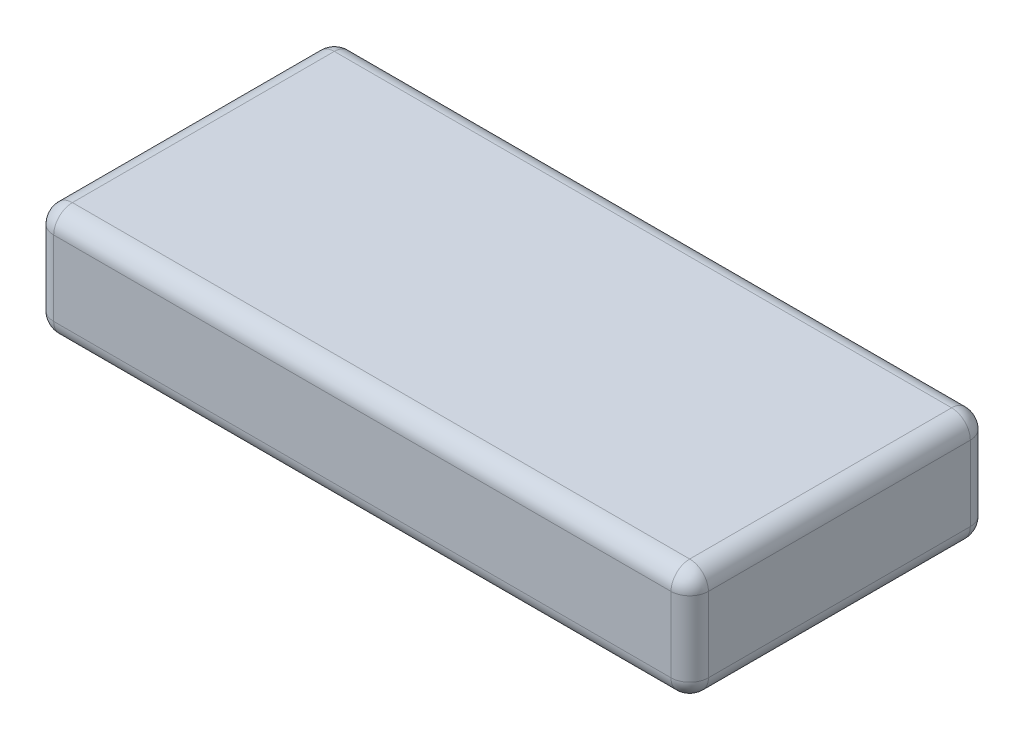
ISO-10303-21;
HEADER;
FILE_DESCRIPTION(('STEP AP214'),'2;1');
FILE_NAME('part.step','',(''),(''),'','','');
FILE_SCHEMA(('AUTOMOTIVE_DESIGN { 1 0 10303 214 1 1 1 1 }'));
ENDSEC;
DATA;
#1=APPLICATION_CONTEXT('core data for automotive mechanical design processes');
#2=APPLICATION_PROTOCOL_DEFINITION('international standard','automotive_design',2000,#1);
#3=PRODUCT_CONTEXT('',#1,'mechanical');
#4=PRODUCT('Part','Part','',(#3));
#5=PRODUCT_RELATED_PRODUCT_CATEGORY('part','',(#4));
#6=PRODUCT_DEFINITION_FORMATION('','',#4);
#7=PRODUCT_DEFINITION_CONTEXT('part definition',#1,'design');
#8=PRODUCT_DEFINITION('design','',#6,#7);
#9=PRODUCT_DEFINITION_SHAPE('','',#8);
#10=(LENGTH_UNIT() NAMED_UNIT(*) SI_UNIT(.MILLI.,.METRE.));
#11=(NAMED_UNIT(*) PLANE_ANGLE_UNIT() SI_UNIT($,.RADIAN.));
#12=(NAMED_UNIT(*) SI_UNIT($,.STERADIAN.) SOLID_ANGLE_UNIT());
#13=UNCERTAINTY_MEASURE_WITH_UNIT(LENGTH_MEASURE(1.E-05),#10,'distance_accuracy_value','');
#14=(GEOMETRIC_REPRESENTATION_CONTEXT(3) GLOBAL_UNCERTAINTY_ASSIGNED_CONTEXT((#13)) GLOBAL_UNIT_ASSIGNED_CONTEXT((#10,
#11,#12)) REPRESENTATION_CONTEXT('',''));
#15=CARTESIAN_POINT('',(0.,0.,0.));
#16=DIRECTION('',(0.,0.,1.));
#17=DIRECTION('',(1.,0.,0.));
#18=AXIS2_PLACEMENT_3D('',#15,#16,#17);
#19=CARTESIAN_POINT('',(33.,88.,-4.));
#20=DIRECTION('',(0.,-1.,0.));
#21=DIRECTION('',(1.,0.,0.));
#22=AXIS2_PLACEMENT_3D('',#19,#20,#21);
#23=SPHERICAL_SURFACE('',#22,2.);
#24=CARTESIAN_POINT('',(33.,88.,-4.));
#25=DIRECTION('',(0.,0.,-1.));
#26=DIRECTION('',(1.,0.,0.));
#27=AXIS2_PLACEMENT_3D('',#24,#25,#26);
#28=CIRCLE('',#27,2.);
#29=CARTESIAN_POINT('',(33.,90.,-4.));
#30=VERTEX_POINT('',#29);
#31=CARTESIAN_POINT('',(35.,88.,-4.));
#32=VERTEX_POINT('',#31);
#33=EDGE_CURVE('E10',#30,#32,#28,.T.);
#34=ORIENTED_EDGE('',*,*,#33,.F.);
#35=CARTESIAN_POINT('',(33.,88.,-4.));
#36=DIRECTION('',(1.,0.,0.));
#37=DIRECTION('',(0.,0.,1.));
#38=AXIS2_PLACEMENT_3D('',#35,#36,#37);
#39=CIRCLE('',#38,2.);
#40=CARTESIAN_POINT('',(33.,88.,-2.));
#41=VERTEX_POINT('',#40);
#42=EDGE_CURVE('E236',#30,#41,#39,.T.);
#43=ORIENTED_EDGE('',*,*,#42,.T.);
#44=CARTESIAN_POINT('',(33.,88.,-4.));
#45=DIRECTION('',(0.,-1.,0.));
#46=DIRECTION('',(1.,0.,0.));
#47=AXIS2_PLACEMENT_3D('',#44,#45,#46);
#48=CIRCLE('',#47,2.);
#49=EDGE_CURVE('E244',#32,#41,#48,.T.);
#50=ORIENTED_EDGE('',*,*,#49,.F.);
#51=EDGE_LOOP('',(#34,#43,#50));
#52=FACE_BOUND('',#51,.T.);
#53=ADVANCED_FACE('F16',(#52),#23,.T.);
#54=CARTESIAN_POINT('',(33.,88.,-32.));
#55=DIRECTION('',(0.,0.,1.));
#56=DIRECTION('',(1.,0.,0.));
#57=AXIS2_PLACEMENT_3D('',#54,#55,#56);
#58=SPHERICAL_SURFACE('',#57,2.);
#59=CARTESIAN_POINT('',(33.,88.,-32.));
#60=DIRECTION('',(0.,-1.,0.));
#61=DIRECTION('',(1.,0.,0.));
#62=AXIS2_PLACEMENT_3D('',#59,#60,#61);
#63=CIRCLE('',#62,2.);
#64=CARTESIAN_POINT('',(33.,88.,-34.));
#65=VERTEX_POINT('',#64);
#66=CARTESIAN_POINT('',(35.,88.,-32.));
#67=VERTEX_POINT('',#66);
#68=EDGE_CURVE('E228',#65,#67,#63,.T.);
#69=ORIENTED_EDGE('',*,*,#68,.F.);
#70=CARTESIAN_POINT('',(33.,88.,-32.));
#71=DIRECTION('',(1.,0.,0.));
#72=DIRECTION('',(0.,1.,0.));
#73=AXIS2_PLACEMENT_3D('',#70,#71,#72);
#74=CIRCLE('',#73,2.);
#75=CARTESIAN_POINT('',(33.,90.,-32.));
#76=VERTEX_POINT('',#75);
#77=EDGE_CURVE('E203',#65,#76,#74,.T.);
#78=ORIENTED_EDGE('',*,*,#77,.T.);
#79=CARTESIAN_POINT('',(33.,88.,-32.));
#80=DIRECTION('',(0.,0.,1.));
#81=DIRECTION('',(1.,0.,0.));
#82=AXIS2_PLACEMENT_3D('',#79,#80,#81);
#83=CIRCLE('',#82,2.);
#84=EDGE_CURVE('E24',#67,#76,#83,.T.);
#85=ORIENTED_EDGE('',*,*,#84,.F.);
#86=EDGE_LOOP('',(#69,#78,#85));
#87=FACE_BOUND('',#86,.T.);
#88=ADVANCED_FACE('F396',(#87),#58,.T.);
#89=CARTESIAN_POINT('',(35.,78.,-34.));
#90=DIRECTION('',(1.,0.,0.));
#91=DIRECTION('',(0.,1.,0.));
#92=AXIS2_PLACEMENT_3D('',#89,#90,#91);
#93=PLANE('',#92);
#94=DIRECTION('',(0.,0.,1.));
#95=VECTOR('',#94,1.);
#96=CARTESIAN_POINT('',(35.,80.,-34.));
#97=LINE('',#96,#95);
#98=CARTESIAN_POINT('',(35.,80.,-32.));
#99=VERTEX_POINT('',#98);
#100=CARTESIAN_POINT('',(35.,80.,-4.));
#101=VERTEX_POINT('',#100);
#102=EDGE_CURVE('E141',#99,#101,#97,.T.);
#103=ORIENTED_EDGE('',*,*,#102,.F.);
#104=DIRECTION('',(0.,1.,0.));
#105=VECTOR('',#104,1.);
#106=CARTESIAN_POINT('',(35.,78.,-32.));
#107=LINE('',#106,#105);
#108=EDGE_CURVE('E232',#99,#67,#107,.T.);
#109=ORIENTED_EDGE('',*,*,#108,.T.);
#110=DIRECTION('',(0.,0.,1.));
#111=VECTOR('',#110,1.);
#112=CARTESIAN_POINT('',(35.,88.,-34.));
#113=LINE('',#112,#111);
#114=EDGE_CURVE('E179',#67,#32,#113,.T.);
#115=ORIENTED_EDGE('',*,*,#114,.T.);
#116=DIRECTION('',(0.,1.,0.));
#117=VECTOR('',#116,1.);
#118=CARTESIAN_POINT('',(35.,78.,-4.));
#119=LINE('',#118,#117);
#120=EDGE_CURVE('E240',#101,#32,#119,.T.);
#121=ORIENTED_EDGE('',*,*,#120,.F.);
#122=EDGE_LOOP('',(#103,#109,#115,#121));
#123=FACE_BOUND('',#122,.T.);
#124=ADVANCED_FACE('F392',(#123),#93,.T.);
#125=CARTESIAN_POINT('',(33.,80.,-4.));
#126=DIRECTION('',(0.,0.,-1.));
#127=DIRECTION('',(1.,0.,0.));
#128=AXIS2_PLACEMENT_3D('',#125,#126,#127);
#129=SPHERICAL_SURFACE('',#128,2.);
#130=CARTESIAN_POINT('',(33.,80.,-4.));
#131=DIRECTION('',(0.,1.,0.));
#132=DIRECTION('',(1.,0.,0.));
#133=AXIS2_PLACEMENT_3D('',#130,#131,#132);
#134=CIRCLE('',#133,2.);
#135=CARTESIAN_POINT('',(33.,80.,-2.));
#136=VERTEX_POINT('',#135);
#137=EDGE_CURVE('E150',#136,#101,#134,.T.);
#138=ORIENTED_EDGE('',*,*,#137,.F.);
#139=CARTESIAN_POINT('',(33.,80.,-4.));
#140=DIRECTION('',(1.,0.,0.));
#141=DIRECTION('',(0.,-1.,0.));
#142=AXIS2_PLACEMENT_3D('',#139,#140,#141);
#143=CIRCLE('',#142,2.);
#144=CARTESIAN_POINT('',(33.,78.,-4.));
#145=VERTEX_POINT('',#144);
#146=EDGE_CURVE('E145',#136,#145,#143,.T.);
#147=ORIENTED_EDGE('',*,*,#146,.T.);
#148=CARTESIAN_POINT('',(33.,80.,-4.));
#149=DIRECTION('',(0.,0.,-1.));
#150=DIRECTION('',(1.,0.,0.));
#151=AXIS2_PLACEMENT_3D('',#148,#149,#150);
#152=CIRCLE('',#151,2.);
#153=EDGE_CURVE('E133',#101,#145,#152,.T.);
#154=ORIENTED_EDGE('',*,*,#153,.F.);
#155=EDGE_LOOP('',(#138,#147,#154));
#156=FACE_BOUND('',#155,.T.);
#157=ADVANCED_FACE('F149',(#156),#129,.T.);
#158=CARTESIAN_POINT('',(33.,80.,-32.));
#159=DIRECTION('',(0.,0.,1.));
#160=DIRECTION('',(1.,0.,0.));
#161=AXIS2_PLACEMENT_3D('',#158,#159,#160);
#162=SPHERICAL_SURFACE('',#161,2.);
#163=CARTESIAN_POINT('',(33.,80.,-32.));
#164=DIRECTION('',(0.,0.,-1.));
#165=DIRECTION('',(1.,0.,0.));
#166=AXIS2_PLACEMENT_3D('',#163,#164,#165);
#167=CIRCLE('',#166,2.);
#168=CARTESIAN_POINT('',(33.,78.,-32.));
#169=VERTEX_POINT('',#168);
#170=EDGE_CURVE('E144',#99,#169,#167,.T.);
#171=ORIENTED_EDGE('',*,*,#170,.T.);
#172=CARTESIAN_POINT('',(33.,80.,-32.));
#173=DIRECTION('',(-1.,0.,0.));
#174=DIRECTION('',(0.,-1.,0.));
#175=AXIS2_PLACEMENT_3D('',#172,#173,#174);
#176=CIRCLE('',#175,2.);
#177=CARTESIAN_POINT('',(33.,80.,-34.));
#178=VERTEX_POINT('',#177);
#179=EDGE_CURVE('E154',#178,#169,#176,.T.);
#180=ORIENTED_EDGE('',*,*,#179,.F.);
#181=CARTESIAN_POINT('',(33.,80.,-32.));
#182=DIRECTION('',(0.,-1.,0.));
#183=DIRECTION('',(1.,0.,0.));
#184=AXIS2_PLACEMENT_3D('',#181,#182,#183);
#185=CIRCLE('',#184,2.);
#186=EDGE_CURVE('E224',#178,#99,#185,.T.);
#187=ORIENTED_EDGE('',*,*,#186,.T.);
#188=EDGE_LOOP('',(#171,#180,#187));
#189=FACE_BOUND('',#188,.T.);
#190=ADVANCED_FACE('F390',(#189),#162,.T.);
#191=CARTESIAN_POINT('',(33.,88.,-34.));
#192=DIRECTION('',(0.,0.,1.));
#193=DIRECTION('',(1.,0.,0.));
#194=AXIS2_PLACEMENT_3D('',#191,#192,#193);
#195=CYLINDRICAL_SURFACE('',#194,2.);
#196=ORIENTED_EDGE('',*,*,#114,.F.);
#197=ORIENTED_EDGE('',*,*,#84,.T.);
#198=DIRECTION('',(0.,0.,1.));
#199=VECTOR('',#198,1.);
#200=CARTESIAN_POINT('',(33.,90.,-34.));
#201=LINE('',#200,#199);
#202=EDGE_CURVE('E217',#76,#30,#201,.T.);
#203=ORIENTED_EDGE('',*,*,#202,.T.);
#204=ORIENTED_EDGE('',*,*,#33,.T.);
#205=EDGE_LOOP('',(#196,#197,#203,#204));
#206=FACE_BOUND('',#205,.T.);
#207=ADVANCED_FACE('F410',(#206),#195,.T.);
#208=CARTESIAN_POINT('',(33.,78.,-4.));
#209=DIRECTION('',(0.,1.,0.));
#210=DIRECTION('',(1.,0.,0.));
#211=AXIS2_PLACEMENT_3D('',#208,#209,#210);
#212=CYLINDRICAL_SURFACE('',#211,2.);
#213=ORIENTED_EDGE('',*,*,#120,.T.);
#214=ORIENTED_EDGE('',*,*,#49,.T.);
#215=DIRECTION('',(0.,1.,0.));
#216=VECTOR('',#215,1.);
#217=CARTESIAN_POINT('',(33.,78.,-2.));
#218=LINE('',#217,#216);
#219=EDGE_CURVE('E200',#136,#41,#218,.T.);
#220=ORIENTED_EDGE('',*,*,#219,.F.);
#221=ORIENTED_EDGE('',*,*,#137,.T.);
#222=EDGE_LOOP('',(#213,#214,#220,#221));
#223=FACE_BOUND('',#222,.T.);
#224=ADVANCED_FACE('F393',(#223),#212,.T.);
#225=CARTESIAN_POINT('',(-35.,88.,-4.));
#226=DIRECTION('',(1.,0.,0.));
#227=DIRECTION('',(0.,1.,0.));
#228=AXIS2_PLACEMENT_3D('',#225,#226,#227);
#229=CYLINDRICAL_SURFACE('',#228,2.);
#230=CARTESIAN_POINT('',(-33.,88.,-4.));
#231=DIRECTION('',(1.,0.,0.));
#232=DIRECTION('',(0.,0.,1.));
#233=AXIS2_PLACEMENT_3D('',#230,#231,#232);
#234=CIRCLE('',#233,2.);
#235=CARTESIAN_POINT('',(-33.,90.,-4.));
#236=VERTEX_POINT('',#235);
#237=CARTESIAN_POINT('',(-33.,88.,-2.));
#238=VERTEX_POINT('',#237);
#239=EDGE_CURVE('E178',#236,#238,#234,.T.);
#240=ORIENTED_EDGE('',*,*,#239,.T.);
#241=DIRECTION('',(1.,0.,0.));
#242=VECTOR('',#241,1.);
#243=CARTESIAN_POINT('',(-35.,88.,-2.));
#244=LINE('',#243,#242);
#245=EDGE_CURVE('E207',#238,#41,#244,.T.);
#246=ORIENTED_EDGE('',*,*,#245,.T.);
#247=ORIENTED_EDGE('',*,*,#42,.F.);
#248=DIRECTION('',(1.,0.,0.));
#249=VECTOR('',#248,1.);
#250=CARTESIAN_POINT('',(-35.,90.,-4.));
#251=LINE('',#250,#249);
#252=EDGE_CURVE('E213',#236,#30,#251,.T.);
#253=ORIENTED_EDGE('',*,*,#252,.F.);
#254=EDGE_LOOP('',(#240,#246,#247,#253));
#255=FACE_BOUND('',#254,.T.);
#256=ADVANCED_FACE('F372',(#255),#229,.T.);
#257=CARTESIAN_POINT('',(33.,78.,-32.));
#258=DIRECTION('',(0.,1.,0.));
#259=DIRECTION('',(1.,0.,0.));
#260=AXIS2_PLACEMENT_3D('',#257,#258,#259);
#261=CYLINDRICAL_SURFACE('',#260,2.);
#262=ORIENTED_EDGE('',*,*,#186,.F.);
#263=DIRECTION('',(0.,1.,0.));
#264=VECTOR('',#263,1.);
#265=CARTESIAN_POINT('',(33.,78.,-34.));
#266=LINE('',#265,#264);
#267=EDGE_CURVE('E184',#178,#65,#266,.T.);
#268=ORIENTED_EDGE('',*,*,#267,.T.);
#269=ORIENTED_EDGE('',*,*,#68,.T.);
#270=ORIENTED_EDGE('',*,*,#108,.F.);
#271=EDGE_LOOP('',(#262,#268,#269,#270));
#272=FACE_BOUND('',#271,.T.);
#273=ADVANCED_FACE('F415',(#272),#261,.T.);
#274=CARTESIAN_POINT('',(-35.,88.,-32.));
#275=DIRECTION('',(1.,0.,0.));
#276=DIRECTION('',(0.,1.,0.));
#277=AXIS2_PLACEMENT_3D('',#274,#275,#276);
#278=CYLINDRICAL_SURFACE('',#277,2.);
#279=DIRECTION('',(1.,0.,0.));
#280=VECTOR('',#279,1.);
#281=CARTESIAN_POINT('',(-35.,90.,-32.));
#282=LINE('',#281,#280);
#283=CARTESIAN_POINT('',(-33.,90.,-32.));
#284=VERTEX_POINT('',#283);
#285=EDGE_CURVE('E220',#284,#76,#282,.T.);
#286=ORIENTED_EDGE('',*,*,#285,.T.);
#287=ORIENTED_EDGE('',*,*,#77,.F.);
#288=DIRECTION('',(1.,0.,0.));
#289=VECTOR('',#288,1.);
#290=CARTESIAN_POINT('',(-35.,88.,-34.));
#291=LINE('',#290,#289);
#292=CARTESIAN_POINT('',(-33.,88.,-34.));
#293=VERTEX_POINT('',#292);
#294=EDGE_CURVE('E165',#293,#65,#291,.T.);
#295=ORIENTED_EDGE('',*,*,#294,.F.);
#296=CARTESIAN_POINT('',(-33.,88.,-32.));
#297=DIRECTION('',(1.,0.,0.));
#298=DIRECTION('',(0.,1.,0.));
#299=AXIS2_PLACEMENT_3D('',#296,#297,#298);
#300=CIRCLE('',#299,2.);
#301=EDGE_CURVE('E192',#293,#284,#300,.T.);
#302=ORIENTED_EDGE('',*,*,#301,.T.);
#303=EDGE_LOOP('',(#286,#287,#295,#302));
#304=FACE_BOUND('',#303,.T.);
#305=ADVANCED_FACE('F382',(#304),#278,.T.);
#306=CARTESIAN_POINT('',(33.,80.,-34.));
#307=DIRECTION('',(0.,0.,1.));
#308=DIRECTION('',(1.,0.,0.));
#309=AXIS2_PLACEMENT_3D('',#306,#307,#308);
#310=CYLINDRICAL_SURFACE('',#309,2.);
#311=ORIENTED_EDGE('',*,*,#153,.T.);
#312=DIRECTION('',(0.,0.,1.));
#313=VECTOR('',#312,1.);
#314=CARTESIAN_POINT('',(33.,78.,-34.));
#315=LINE('',#314,#313);
#316=EDGE_CURVE('E138',#169,#145,#315,.T.);
#317=ORIENTED_EDGE('',*,*,#316,.F.);
#318=ORIENTED_EDGE('',*,*,#170,.F.);
#319=ORIENTED_EDGE('',*,*,#102,.T.);
#320=EDGE_LOOP('',(#311,#317,#318,#319));
#321=FACE_BOUND('',#320,.T.);
#322=ADVANCED_FACE('F135',(#321),#310,.T.);
#323=CARTESIAN_POINT('',(-35.,80.,-4.));
#324=DIRECTION('',(1.,0.,0.));
#325=DIRECTION('',(0.,-1.,0.));
#326=AXIS2_PLACEMENT_3D('',#323,#324,#325);
#327=CYLINDRICAL_SURFACE('',#326,2.);
#328=DIRECTION('',(1.,0.,0.));
#329=VECTOR('',#328,1.);
#330=CARTESIAN_POINT('',(-35.,78.,-4.));
#331=LINE('',#330,#329);
#332=CARTESIAN_POINT('',(-33.,78.,-4.));
#333=VERTEX_POINT('',#332);
#334=EDGE_CURVE('E157',#333,#145,#331,.T.);
#335=ORIENTED_EDGE('',*,*,#334,.T.);
#336=ORIENTED_EDGE('',*,*,#146,.F.);
#337=DIRECTION('',(1.,0.,0.));
#338=VECTOR('',#337,1.);
#339=CARTESIAN_POINT('',(-35.,80.,-2.));
#340=LINE('',#339,#338);
#341=CARTESIAN_POINT('',(-33.,80.,-2.));
#342=VERTEX_POINT('',#341);
#343=EDGE_CURVE('E196',#342,#136,#340,.T.);
#344=ORIENTED_EDGE('',*,*,#343,.F.);
#345=CARTESIAN_POINT('',(-33.,80.,-4.));
#346=DIRECTION('',(1.,0.,0.));
#347=DIRECTION('',(0.,-1.,0.));
#348=AXIS2_PLACEMENT_3D('',#345,#346,#347);
#349=CIRCLE('',#348,2.);
#350=EDGE_CURVE('E160',#342,#333,#349,.T.);
#351=ORIENTED_EDGE('',*,*,#350,.T.);
#352=EDGE_LOOP('',(#335,#336,#344,#351));
#353=FACE_BOUND('',#352,.T.);
#354=ADVANCED_FACE('F158',(#353),#327,.T.);
#355=CARTESIAN_POINT('',(-35.,80.,-32.));
#356=DIRECTION('',(1.,0.,0.));
#357=DIRECTION('',(0.,-1.,0.));
#358=AXIS2_PLACEMENT_3D('',#355,#356,#357);
#359=CYLINDRICAL_SURFACE('',#358,2.);
#360=CARTESIAN_POINT('',(-33.,80.,-32.));
#361=DIRECTION('',(-1.,0.,0.));
#362=DIRECTION('',(0.,-1.,0.));
#363=AXIS2_PLACEMENT_3D('',#360,#361,#362);
#364=CIRCLE('',#363,2.);
#365=CARTESIAN_POINT('',(-33.,80.,-34.));
#366=VERTEX_POINT('',#365);
#367=CARTESIAN_POINT('',(-33.,78.,-32.));
#368=VERTEX_POINT('',#367);
#369=EDGE_CURVE('E259',#366,#368,#364,.T.);
#370=ORIENTED_EDGE('',*,*,#369,.F.);
#371=DIRECTION('',(1.,0.,0.));
#372=VECTOR('',#371,1.);
#373=CARTESIAN_POINT('',(-35.,80.,-34.));
#374=LINE('',#373,#372);
#375=EDGE_CURVE('E188',#366,#178,#374,.T.);
#376=ORIENTED_EDGE('',*,*,#375,.T.);
#377=ORIENTED_EDGE('',*,*,#179,.T.);
#378=DIRECTION('',(1.,0.,0.));
#379=VECTOR('',#378,1.);
#380=CARTESIAN_POINT('',(-35.,78.,-32.));
#381=LINE('',#380,#379);
#382=EDGE_CURVE('E168',#368,#169,#381,.T.);
#383=ORIENTED_EDGE('',*,*,#382,.F.);
#384=EDGE_LOOP('',(#370,#376,#377,#383));
#385=FACE_BOUND('',#384,.T.);
#386=ADVANCED_FACE('F387',(#385),#359,.T.);
#387=CARTESIAN_POINT('',(-35.,90.,-34.));
#388=DIRECTION('',(0.,1.,0.));
#389=DIRECTION('',(1.,0.,0.));
#390=AXIS2_PLACEMENT_3D('',#387,#388,#389);
#391=PLANE('',#390);
#392=DIRECTION('',(0.,0.,1.));
#393=VECTOR('',#392,1.);
#394=CARTESIAN_POINT('',(-33.,90.,-34.));
#395=LINE('',#394,#393);
#396=EDGE_CURVE('E272',#284,#236,#395,.T.);
#397=ORIENTED_EDGE('',*,*,#396,.T.);
#398=ORIENTED_EDGE('',*,*,#252,.T.);
#399=ORIENTED_EDGE('',*,*,#202,.F.);
#400=ORIENTED_EDGE('',*,*,#285,.F.);
#401=EDGE_LOOP('',(#397,#398,#399,#400));
#402=FACE_BOUND('',#401,.T.);
#403=ADVANCED_FACE('F379',(#402),#391,.T.);
#404=CARTESIAN_POINT('',(-33.,88.,-4.));
#405=DIRECTION('',(0.,-1.,0.));
#406=DIRECTION('',(-1.,0.,0.));
#407=AXIS2_PLACEMENT_3D('',#404,#405,#406);
#408=SPHERICAL_SURFACE('',#407,2.);
#409=CARTESIAN_POINT('',(-33.,88.,-4.));
#410=DIRECTION('',(0.,1.,0.));
#411=DIRECTION('',(-1.,0.,0.));
#412=AXIS2_PLACEMENT_3D('',#409,#410,#411);
#413=CIRCLE('',#412,2.);
#414=CARTESIAN_POINT('',(-35.,88.,-4.));
#415=VERTEX_POINT('',#414);
#416=EDGE_CURVE('E323',#415,#238,#413,.T.);
#417=ORIENTED_EDGE('',*,*,#416,.T.);
#418=ORIENTED_EDGE('',*,*,#239,.F.);
#419=CARTESIAN_POINT('',(-33.,88.,-4.));
#420=DIRECTION('',(0.,0.,1.));
#421=DIRECTION('',(-1.,0.,0.));
#422=AXIS2_PLACEMENT_3D('',#419,#420,#421);
#423=CIRCLE('',#422,2.);
#424=EDGE_CURVE('E282',#236,#415,#423,.T.);
#425=ORIENTED_EDGE('',*,*,#424,.T.);
#426=EDGE_LOOP('',(#417,#418,#425));
#427=FACE_BOUND('',#426,.T.);
#428=ADVANCED_FACE('F334',(#427),#408,.T.);
#429=CARTESIAN_POINT('',(-35.,78.,-2.));
#430=DIRECTION('',(0.,0.,1.));
#431=DIRECTION('',(1.,0.,0.));
#432=AXIS2_PLACEMENT_3D('',#429,#430,#431);
#433=PLANE('',#432);
#434=DIRECTION('',(0.,1.,0.));
#435=VECTOR('',#434,1.);
#436=CARTESIAN_POINT('',(-33.,78.,-2.));
#437=LINE('',#436,#435);
#438=EDGE_CURVE('E322',#342,#238,#437,.T.);
#439=ORIENTED_EDGE('',*,*,#438,.F.);
#440=ORIENTED_EDGE('',*,*,#343,.T.);
#441=ORIENTED_EDGE('',*,*,#219,.T.);
#442=ORIENTED_EDGE('',*,*,#245,.F.);
#443=EDGE_LOOP('',(#439,#440,#441,#442));
#444=FACE_BOUND('',#443,.T.);
#445=ADVANCED_FACE('F369',(#444),#433,.T.);
#446=CARTESIAN_POINT('',(-33.,88.,-32.));
#447=DIRECTION('',(0.,0.,1.));
#448=DIRECTION('',(-1.,0.,0.));
#449=AXIS2_PLACEMENT_3D('',#446,#447,#448);
#450=SPHERICAL_SURFACE('',#449,2.);
#451=CARTESIAN_POINT('',(-33.,88.,-32.));
#452=DIRECTION('',(0.,0.,-1.));
#453=DIRECTION('',(-1.,0.,0.));
#454=AXIS2_PLACEMENT_3D('',#451,#452,#453);
#455=CIRCLE('',#454,2.);
#456=CARTESIAN_POINT('',(-35.,88.,-32.));
#457=VERTEX_POINT('',#456);
#458=EDGE_CURVE('E263',#457,#284,#455,.T.);
#459=ORIENTED_EDGE('',*,*,#458,.T.);
#460=ORIENTED_EDGE('',*,*,#301,.F.);
#461=CARTESIAN_POINT('',(-33.,88.,-32.));
#462=DIRECTION('',(0.,1.,0.));
#463=DIRECTION('',(-1.,0.,0.));
#464=AXIS2_PLACEMENT_3D('',#461,#462,#463);
#465=CIRCLE('',#464,2.);
#466=EDGE_CURVE('E313',#293,#457,#465,.T.);
#467=ORIENTED_EDGE('',*,*,#466,.T.);
#468=EDGE_LOOP('',(#459,#460,#467));
#469=FACE_BOUND('',#468,.T.);
#470=ADVANCED_FACE('F356',(#469),#450,.T.);
#471=CARTESIAN_POINT('',(-35.,78.,-34.));
#472=DIRECTION('',(0.,0.,1.));
#473=DIRECTION('',(1.,0.,0.));
#474=AXIS2_PLACEMENT_3D('',#471,#472,#473);
#475=PLANE('',#474);
#476=ORIENTED_EDGE('',*,*,#294,.T.);
#477=ORIENTED_EDGE('',*,*,#267,.F.);
#478=ORIENTED_EDGE('',*,*,#375,.F.);
#479=DIRECTION('',(0.,1.,0.));
#480=VECTOR('',#479,1.);
#481=CARTESIAN_POINT('',(-33.,78.,-34.));
#482=LINE('',#481,#480);
#483=EDGE_CURVE('E311',#366,#293,#482,.T.);
#484=ORIENTED_EDGE('',*,*,#483,.T.);
#485=EDGE_LOOP('',(#476,#477,#478,#484));
#486=FACE_BOUND('',#485,.T.);
#487=ADVANCED_FACE('F385',(#486),#475,.F.);
#488=CARTESIAN_POINT('',(-35.,78.,-34.));
#489=DIRECTION('',(0.,1.,0.));
#490=DIRECTION('',(1.,0.,0.));
#491=AXIS2_PLACEMENT_3D('',#488,#489,#490);
#492=PLANE('',#491);
#493=ORIENTED_EDGE('',*,*,#382,.T.);
#494=ORIENTED_EDGE('',*,*,#316,.T.);
#495=ORIENTED_EDGE('',*,*,#334,.F.);
#496=DIRECTION('',(0.,0.,1.));
#497=VECTOR('',#496,1.);
#498=CARTESIAN_POINT('',(-33.,78.,-34.));
#499=LINE('',#498,#497);
#500=EDGE_CURVE('E302',#368,#333,#499,.T.);
#501=ORIENTED_EDGE('',*,*,#500,.F.);
#502=EDGE_LOOP('',(#493,#494,#495,#501));
#503=FACE_BOUND('',#502,.T.);
#504=ADVANCED_FACE('F167',(#503),#492,.F.);
#505=CARTESIAN_POINT('',(-33.,80.,-4.));
#506=DIRECTION('',(0.,0.,-1.));
#507=DIRECTION('',(-1.,0.,0.));
#508=AXIS2_PLACEMENT_3D('',#505,#506,#507);
#509=SPHERICAL_SURFACE('',#508,2.);
#510=CARTESIAN_POINT('',(-33.,80.,-4.));
#511=DIRECTION('',(0.,0.,1.));
#512=DIRECTION('',(-1.,0.,0.));
#513=AXIS2_PLACEMENT_3D('',#510,#511,#512);
#514=CIRCLE('',#513,2.);
#515=CARTESIAN_POINT('',(-35.,80.,-4.));
#516=VERTEX_POINT('',#515);
#517=EDGE_CURVE('E306',#516,#333,#514,.T.);
#518=ORIENTED_EDGE('',*,*,#517,.T.);
#519=ORIENTED_EDGE('',*,*,#350,.F.);
#520=CARTESIAN_POINT('',(-33.,80.,-4.));
#521=DIRECTION('',(0.,-1.,0.));
#522=DIRECTION('',(-1.,0.,0.));
#523=AXIS2_PLACEMENT_3D('',#520,#521,#522);
#524=CIRCLE('',#523,2.);
#525=EDGE_CURVE('E310',#342,#516,#524,.T.);
#526=ORIENTED_EDGE('',*,*,#525,.T.);
#527=EDGE_LOOP('',(#518,#519,#526));
#528=FACE_BOUND('',#527,.T.);
#529=ADVANCED_FACE('F366',(#528),#509,.T.);
#530=CARTESIAN_POINT('',(-33.,80.,-32.));
#531=DIRECTION('',(0.,0.,1.));
#532=DIRECTION('',(-1.,0.,0.));
#533=AXIS2_PLACEMENT_3D('',#530,#531,#532);
#534=SPHERICAL_SURFACE('',#533,2.);
#535=CARTESIAN_POINT('',(-33.,80.,-32.));
#536=DIRECTION('',(0.,1.,0.));
#537=DIRECTION('',(-1.,0.,0.));
#538=AXIS2_PLACEMENT_3D('',#535,#536,#537);
#539=CIRCLE('',#538,2.);
#540=CARTESIAN_POINT('',(-35.,80.,-32.));
#541=VERTEX_POINT('',#540);
#542=EDGE_CURVE('E307',#366,#541,#539,.T.);
#543=ORIENTED_EDGE('',*,*,#542,.F.);
#544=ORIENTED_EDGE('',*,*,#369,.T.);
#545=CARTESIAN_POINT('',(-33.,80.,-32.));
#546=DIRECTION('',(0.,0.,1.));
#547=DIRECTION('',(-1.,0.,0.));
#548=AXIS2_PLACEMENT_3D('',#545,#546,#547);
#549=CIRCLE('',#548,2.);
#550=EDGE_CURVE('E295',#541,#368,#549,.T.);
#551=ORIENTED_EDGE('',*,*,#550,.F.);
#552=EDGE_LOOP('',(#543,#544,#551));
#553=FACE_BOUND('',#552,.T.);
#554=ADVANCED_FACE('F361',(#553),#534,.T.);
#555=CARTESIAN_POINT('',(-33.,88.,-34.));
#556=DIRECTION('',(0.,0.,1.));
#557=DIRECTION('',(-1.,0.,0.));
#558=AXIS2_PLACEMENT_3D('',#555,#556,#557);
#559=CYLINDRICAL_SURFACE('',#558,2.);
#560=ORIENTED_EDGE('',*,*,#424,.F.);
#561=ORIENTED_EDGE('',*,*,#396,.F.);
#562=ORIENTED_EDGE('',*,*,#458,.F.);
#563=DIRECTION('',(0.,0.,1.));
#564=VECTOR('',#563,1.);
#565=CARTESIAN_POINT('',(-35.,88.,-34.));
#566=LINE('',#565,#564);
#567=EDGE_CURVE('E286',#457,#415,#566,.T.);
#568=ORIENTED_EDGE('',*,*,#567,.T.);
#569=EDGE_LOOP('',(#560,#561,#562,#568));
#570=FACE_BOUND('',#569,.T.);
#571=ADVANCED_FACE('F345',(#570),#559,.T.);
#572=CARTESIAN_POINT('',(-33.,78.,-4.));
#573=DIRECTION('',(0.,1.,0.));
#574=DIRECTION('',(-1.,0.,0.));
#575=AXIS2_PLACEMENT_3D('',#572,#573,#574);
#576=CYLINDRICAL_SURFACE('',#575,2.);
#577=ORIENTED_EDGE('',*,*,#525,.F.);
#578=ORIENTED_EDGE('',*,*,#438,.T.);
#579=ORIENTED_EDGE('',*,*,#416,.F.);
#580=DIRECTION('',(0.,1.,0.));
#581=VECTOR('',#580,1.);
#582=CARTESIAN_POINT('',(-35.,78.,-4.));
#583=LINE('',#582,#581);
#584=EDGE_CURVE('E342',#516,#415,#583,.T.);
#585=ORIENTED_EDGE('',*,*,#584,.F.);
#586=EDGE_LOOP('',(#577,#578,#579,#585));
#587=FACE_BOUND('',#586,.T.);
#588=ADVANCED_FACE('F340',(#587),#576,.T.);
#589=CARTESIAN_POINT('',(-33.,78.,-32.));
#590=DIRECTION('',(0.,1.,0.));
#591=DIRECTION('',(-1.,0.,0.));
#592=AXIS2_PLACEMENT_3D('',#589,#590,#591);
#593=CYLINDRICAL_SURFACE('',#592,2.);
#594=DIRECTION('',(0.,1.,0.));
#595=VECTOR('',#594,1.);
#596=CARTESIAN_POINT('',(-35.,78.,-32.));
#597=LINE('',#596,#595);
#598=EDGE_CURVE('E288',#541,#457,#597,.T.);
#599=ORIENTED_EDGE('',*,*,#598,.T.);
#600=ORIENTED_EDGE('',*,*,#466,.F.);
#601=ORIENTED_EDGE('',*,*,#483,.F.);
#602=ORIENTED_EDGE('',*,*,#542,.T.);
#603=EDGE_LOOP('',(#599,#600,#601,#602));
#604=FACE_BOUND('',#603,.T.);
#605=ADVANCED_FACE('F360',(#604),#593,.T.);
#606=CARTESIAN_POINT('',(-33.,80.,-34.));
#607=DIRECTION('',(0.,0.,1.));
#608=DIRECTION('',(-1.,0.,0.));
#609=AXIS2_PLACEMENT_3D('',#606,#607,#608);
#610=CYLINDRICAL_SURFACE('',#609,2.);
#611=DIRECTION('',(0.,0.,1.));
#612=VECTOR('',#611,1.);
#613=CARTESIAN_POINT('',(-35.,80.,-34.));
#614=LINE('',#613,#612);
#615=EDGE_CURVE('E291',#541,#516,#614,.T.);
#616=ORIENTED_EDGE('',*,*,#615,.F.);
#617=ORIENTED_EDGE('',*,*,#550,.T.);
#618=ORIENTED_EDGE('',*,*,#500,.T.);
#619=ORIENTED_EDGE('',*,*,#517,.F.);
#620=EDGE_LOOP('',(#616,#617,#618,#619));
#621=FACE_BOUND('',#620,.T.);
#622=ADVANCED_FACE('F364',(#621),#610,.T.);
#623=CARTESIAN_POINT('',(-35.,78.,-34.));
#624=DIRECTION('',(1.,0.,0.));
#625=DIRECTION('',(0.,1.,0.));
#626=AXIS2_PLACEMENT_3D('',#623,#624,#625);
#627=PLANE('',#626);
#628=ORIENTED_EDGE('',*,*,#584,.T.);
#629=ORIENTED_EDGE('',*,*,#567,.F.);
#630=ORIENTED_EDGE('',*,*,#598,.F.);
#631=ORIENTED_EDGE('',*,*,#615,.T.);
#632=EDGE_LOOP('',(#628,#629,#630,#631));
#633=FACE_BOUND('',#632,.T.);
#634=ADVANCED_FACE('F348',(#633),#627,.F.);
#635=CLOSED_SHELL('',(#53,#88,#124,#157,#190,#207,#224,#256,#273,#305,#322,#354,#386,#403,#428,
#445,#470,#487,#504,#529,#554,#571,#588,#605,#622,#634));
#636=MANIFOLD_SOLID_BREP('B1',#635);
#637=ADVANCED_BREP_SHAPE_REPRESENTATION('',(#18,#636),#14);
#638=SHAPE_DEFINITION_REPRESENTATION(#9,#637);
ENDSEC;
END-ISO-10303-21;
